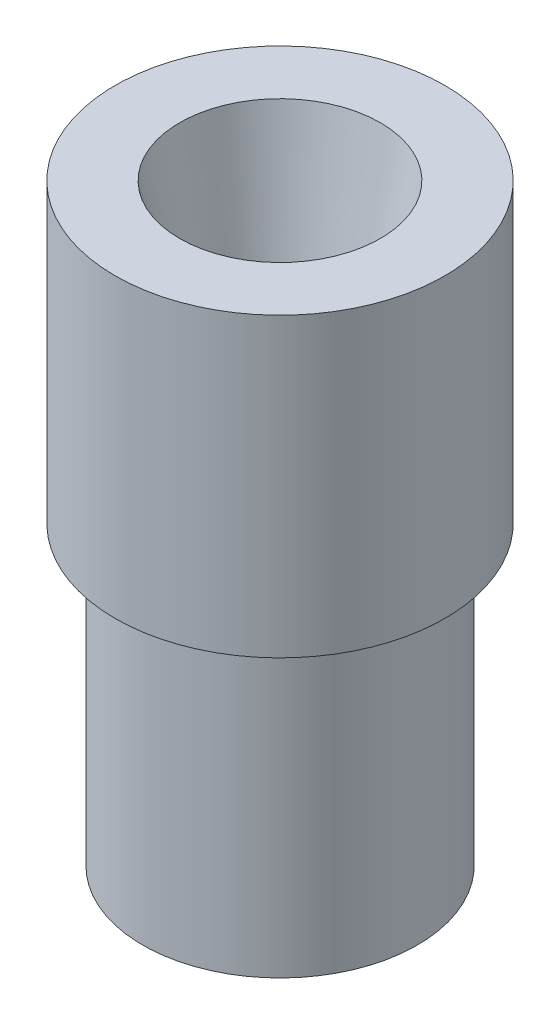
ISO-10303-21;
HEADER;
FILE_DESCRIPTION(('STEP AP214'),'2;1');
FILE_NAME('part.step','',(''),(''),'','','');
FILE_SCHEMA(('AUTOMOTIVE_DESIGN { 1 0 10303 214 1 1 1 1 }'));
ENDSEC;
DATA;
#1=APPLICATION_CONTEXT('core data for automotive mechanical design processes');
#2=APPLICATION_PROTOCOL_DEFINITION('international standard','automotive_design',2000,#1);
#3=PRODUCT_CONTEXT('',#1,'mechanical');
#4=PRODUCT('Part','Part','',(#3));
#5=PRODUCT_RELATED_PRODUCT_CATEGORY('part','',(#4));
#6=PRODUCT_DEFINITION_FORMATION('','',#4);
#7=PRODUCT_DEFINITION_CONTEXT('part definition',#1,'design');
#8=PRODUCT_DEFINITION('design','',#6,#7);
#9=PRODUCT_DEFINITION_SHAPE('','',#8);
#10=(LENGTH_UNIT() NAMED_UNIT(*) SI_UNIT(.MILLI.,.METRE.));
#11=(NAMED_UNIT(*) PLANE_ANGLE_UNIT() SI_UNIT($,.RADIAN.));
#12=(NAMED_UNIT(*) SI_UNIT($,.STERADIAN.) SOLID_ANGLE_UNIT());
#13=UNCERTAINTY_MEASURE_WITH_UNIT(LENGTH_MEASURE(1.E-05),#10,'distance_accuracy_value','');
#14=(GEOMETRIC_REPRESENTATION_CONTEXT(3) GLOBAL_UNCERTAINTY_ASSIGNED_CONTEXT((#13)) GLOBAL_UNIT_ASSIGNED_CONTEXT((#10,
#11,#12)) REPRESENTATION_CONTEXT('',''));
#15=CARTESIAN_POINT('',(0.,0.,0.));
#16=DIRECTION('',(0.,0.,1.));
#17=DIRECTION('',(1.,0.,0.));
#18=AXIS2_PLACEMENT_3D('',#15,#16,#17);
#19=CARTESIAN_POINT('',(0.,20.,0.));
#20=DIRECTION('',(0.,1.,0.));
#21=DIRECTION('',(0.,0.,1.));
#22=AXIS2_PLACEMENT_3D('',#19,#20,#21);
#23=PLANE('',#22);
#24=CARTESIAN_POINT('',(0.,20.,0.));
#25=DIRECTION('',(0.,1.,0.));
#26=DIRECTION('',(0.,0.,1.));
#27=AXIS2_PLACEMENT_3D('',#24,#25,#26);
#28=CIRCLE('',#27,3.38163490354233);
#29=CARTESIAN_POINT('',(0.,20.,3.38163490354233));
#30=VERTEX_POINT('',#29);
#31=EDGE_CURVE('E35',#30,#30,#28,.T.);
#32=ORIENTED_EDGE('',*,*,#31,.F.);
#33=EDGE_LOOP('',(#32));
#34=FACE_BOUND('',#33,.T.);
#35=CARTESIAN_POINT('',(0.,20.,0.));
#36=DIRECTION('',(0.,-1.,0.));
#37=DIRECTION('',(0.,0.,-1.));
#38=AXIS2_PLACEMENT_3D('',#35,#36,#37);
#39=CIRCLE('',#38,5.55625);
#40=CARTESIAN_POINT('',(0.,20.,-5.55625));
#41=VERTEX_POINT('',#40);
#42=EDGE_CURVE('E10',#41,#41,#39,.T.);
#43=ORIENTED_EDGE('',*,*,#42,.F.);
#44=EDGE_LOOP('',(#43));
#45=FACE_BOUND('',#44,.T.);
#46=ADVANCED_FACE('F31',(#34,#45),#23,.T.);
#47=CARTESIAN_POINT('',(0.,0.,0.));
#48=DIRECTION('',(0.,-1.,0.));
#49=DIRECTION('',(0.,0.,-1.));
#50=AXIS2_PLACEMENT_3D('',#47,#48,#49);
#51=CYLINDRICAL_SURFACE('',#50,5.55625);
#52=ORIENTED_EDGE('',*,*,#42,.T.);
#53=EDGE_LOOP('',(#52));
#54=FACE_BOUND('',#53,.T.);
#55=CARTESIAN_POINT('',(0.,10.,0.));
#56=DIRECTION('',(0.,-1.,0.));
#57=DIRECTION('',(0.,0.,-1.));
#58=AXIS2_PLACEMENT_3D('',#55,#56,#57);
#59=CIRCLE('',#58,5.55625);
#60=CARTESIAN_POINT('',(0.,10.,-5.55625));
#61=VERTEX_POINT('',#60);
#62=EDGE_CURVE('E39',#61,#61,#59,.T.);
#63=ORIENTED_EDGE('',*,*,#62,.F.);
#64=EDGE_LOOP('',(#63));
#65=FACE_BOUND('',#64,.T.);
#66=ADVANCED_FACE('F61',(#54,#65),#51,.T.);
#67=CARTESIAN_POINT('',(5.55625,10.,0.));
#68=DIRECTION('',(0.,-1.,0.));
#69=DIRECTION('',(0.,0.,-1.));
#70=AXIS2_PLACEMENT_3D('',#67,#68,#69);
#71=PLANE('',#70);
#72=ORIENTED_EDGE('',*,*,#62,.T.);
#73=EDGE_LOOP('',(#72));
#74=FACE_BOUND('',#73,.T.);
#75=CARTESIAN_POINT('',(0.,10.,0.));
#76=DIRECTION('',(0.,-1.,0.));
#77=DIRECTION('',(0.,0.,-1.));
#78=AXIS2_PLACEMENT_3D('',#75,#76,#77);
#79=CIRCLE('',#78,4.625);
#80=CARTESIAN_POINT('',(0.,10.,-4.625));
#81=VERTEX_POINT('',#80);
#82=EDGE_CURVE('E43',#81,#81,#79,.T.);
#83=ORIENTED_EDGE('',*,*,#82,.F.);
#84=EDGE_LOOP('',(#83));
#85=FACE_BOUND('',#84,.T.);
#86=ADVANCED_FACE('F65',(#74,#85),#71,.T.);
#87=CARTESIAN_POINT('',(0.,0.,0.));
#88=DIRECTION('',(0.,-1.,0.));
#89=DIRECTION('',(0.,0.,-1.));
#90=AXIS2_PLACEMENT_3D('',#87,#88,#89);
#91=CYLINDRICAL_SURFACE('',#90,4.625);
#92=ORIENTED_EDGE('',*,*,#82,.T.);
#93=EDGE_LOOP('',(#92));
#94=FACE_BOUND('',#93,.T.);
#95=CARTESIAN_POINT('',(0.,0.,0.));
#96=DIRECTION('',(0.,-1.,0.));
#97=DIRECTION('',(0.,0.,-1.));
#98=AXIS2_PLACEMENT_3D('',#95,#96,#97);
#99=CIRCLE('',#98,4.625);
#100=CARTESIAN_POINT('',(0.,0.,-4.625));
#101=VERTEX_POINT('',#100);
#102=EDGE_CURVE('E48',#101,#101,#99,.T.);
#103=ORIENTED_EDGE('',*,*,#102,.F.);
#104=EDGE_LOOP('',(#103));
#105=FACE_BOUND('',#104,.T.);
#106=ADVANCED_FACE('F70',(#94,#105),#91,.T.);
#107=CARTESIAN_POINT('',(4.625,0.,0.));
#108=DIRECTION('',(0.,-1.,0.));
#109=DIRECTION('',(0.,0.,-1.));
#110=AXIS2_PLACEMENT_3D('',#107,#108,#109);
#111=PLANE('',#110);
#112=ORIENTED_EDGE('',*,*,#102,.T.);
#113=EDGE_LOOP('',(#112));
#114=FACE_BOUND('',#113,.T.);
#115=ADVANCED_FACE('F74',(#114),#111,.T.);
#116=CARTESIAN_POINT('',(0.,15.,0.));
#117=DIRECTION('',(0.,1.,0.));
#118=DIRECTION('',(0.,0.,1.));
#119=AXIS2_PLACEMENT_3D('',#116,#117,#118);
#120=CONICAL_SURFACE('',#119,2.5,0.174532925199433);
#121=CARTESIAN_POINT('',(0.,15.,0.));
#122=DIRECTION('',(0.,1.,0.));
#123=DIRECTION('',(0.,0.,1.));
#124=AXIS2_PLACEMENT_3D('',#121,#122,#123);
#125=CIRCLE('',#124,2.5);
#126=CARTESIAN_POINT('',(0.,15.,2.5));
#127=VERTEX_POINT('',#126);
#128=EDGE_CURVE('E51',#127,#127,#125,.T.);
#129=ORIENTED_EDGE('',*,*,#128,.F.);
#130=EDGE_LOOP('',(#129));
#131=FACE_BOUND('',#130,.T.);
#132=ORIENTED_EDGE('',*,*,#31,.T.);
#133=EDGE_LOOP('',(#132));
#134=FACE_BOUND('',#133,.T.);
#135=ADVANCED_FACE('F33',(#131,#134),#120,.F.);
#136=CARTESIAN_POINT('',(0.,15.,0.));
#137=DIRECTION('',(0.,1.,0.));
#138=DIRECTION('',(0.,0.,1.));
#139=AXIS2_PLACEMENT_3D('',#136,#137,#138);
#140=PLANE('',#139);
#141=ORIENTED_EDGE('',*,*,#128,.T.);
#142=EDGE_LOOP('',(#141));
#143=FACE_BOUND('',#142,.T.);
#144=ADVANCED_FACE('F79',(#143),#140,.T.);
#145=CLOSED_SHELL('',(#46,#66,#86,#106,#115,#135,#144));
#146=MANIFOLD_SOLID_BREP('B2',#145);
#147=ADVANCED_BREP_SHAPE_REPRESENTATION('',(#18,#146),#14);
#148=SHAPE_DEFINITION_REPRESENTATION(#9,#147);
ENDSEC;
END-ISO-10303-21;
